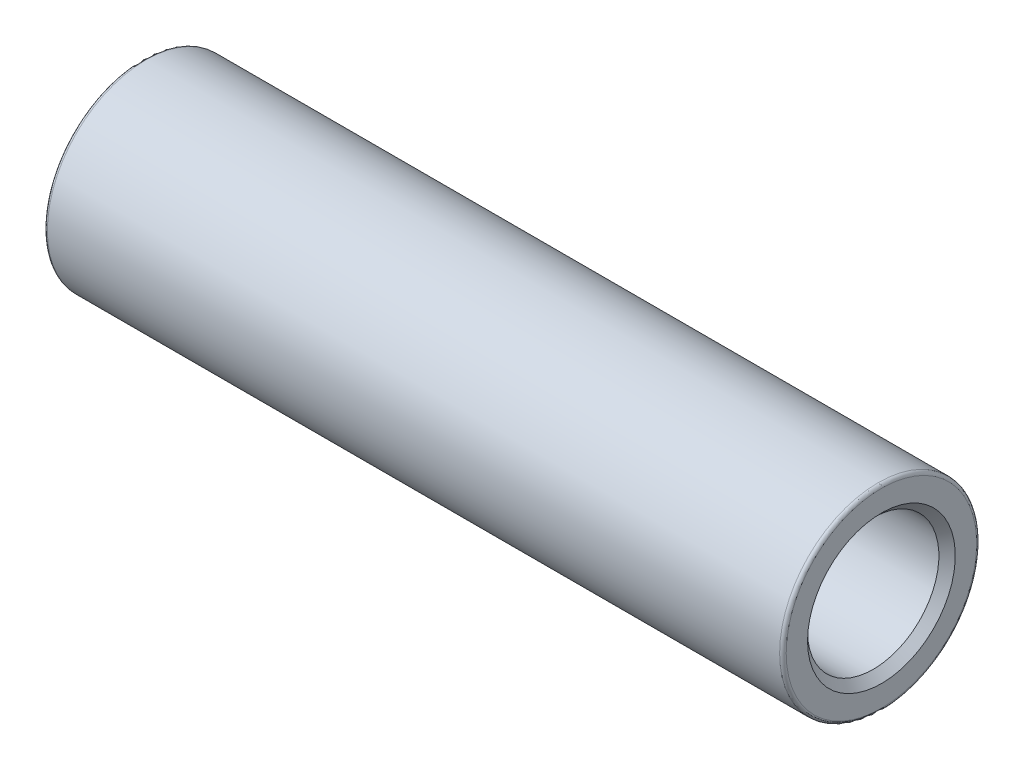
ISO-10303-21;
HEADER;
FILE_DESCRIPTION(('STEP AP214'),'2;1');
FILE_NAME('part.step','',(''),(''),'','','');
FILE_SCHEMA(('AUTOMOTIVE_DESIGN { 1 0 10303 214 1 1 1 1 }'));
ENDSEC;
DATA;
#1=APPLICATION_CONTEXT('core data for automotive mechanical design processes');
#2=APPLICATION_PROTOCOL_DEFINITION('international standard','automotive_design',2000,#1);
#3=PRODUCT_CONTEXT('',#1,'mechanical');
#4=PRODUCT('Part','Part','',(#3));
#5=PRODUCT_RELATED_PRODUCT_CATEGORY('part','',(#4));
#6=PRODUCT_DEFINITION_FORMATION('','',#4);
#7=PRODUCT_DEFINITION_CONTEXT('part definition',#1,'design');
#8=PRODUCT_DEFINITION('design','',#6,#7);
#9=PRODUCT_DEFINITION_SHAPE('','',#8);
#10=(LENGTH_UNIT() NAMED_UNIT(*) SI_UNIT(.MILLI.,.METRE.));
#11=(NAMED_UNIT(*) PLANE_ANGLE_UNIT() SI_UNIT($,.RADIAN.));
#12=(NAMED_UNIT(*) SI_UNIT($,.STERADIAN.) SOLID_ANGLE_UNIT());
#13=UNCERTAINTY_MEASURE_WITH_UNIT(LENGTH_MEASURE(1.E-05),#10,'distance_accuracy_value','');
#14=(GEOMETRIC_REPRESENTATION_CONTEXT(3) GLOBAL_UNCERTAINTY_ASSIGNED_CONTEXT((#13)) GLOBAL_UNIT_ASSIGNED_CONTEXT((#10,
#11,#12)) REPRESENTATION_CONTEXT('',''));
#15=CARTESIAN_POINT('',(0.,0.,0.));
#16=DIRECTION('',(0.,0.,1.));
#17=DIRECTION('',(1.,0.,0.));
#18=AXIS2_PLACEMENT_3D('',#15,#16,#17);
#19=CARTESIAN_POINT('',(-32.2635156377837,0.,0.));
#20=DIRECTION('',(-1.,0.,0.));
#21=DIRECTION('',(0.,0.,1.));
#22=AXIS2_PLACEMENT_3D('',#19,#20,#21);
#23=CYLINDRICAL_SURFACE('',#22,6.);
#24=CARTESIAN_POINT('',(-22.3,0.,0.));
#25=DIRECTION('',(1.,0.,0.));
#26=DIRECTION('',(0.,0.,-1.));
#27=AXIS2_PLACEMENT_3D('',#24,#25,#26);
#28=CIRCLE('',#27,6.);
#29=CARTESIAN_POINT('',(-22.3,0.,-6.));
#30=VERTEX_POINT('',#29);
#31=EDGE_CURVE('E38',#30,#30,#28,.T.);
#32=ORIENTED_EDGE('',*,*,#31,.T.);
#33=EDGE_LOOP('',(#32));
#34=FACE_BOUND('',#33,.T.);
#35=CARTESIAN_POINT('',(22.3,0.,0.));
#36=DIRECTION('',(-1.,0.,0.));
#37=DIRECTION('',(0.,0.,1.));
#38=AXIS2_PLACEMENT_3D('',#35,#36,#37);
#39=CIRCLE('',#38,6.);
#40=CARTESIAN_POINT('',(22.3,0.,6.));
#41=VERTEX_POINT('',#40);
#42=EDGE_CURVE('E41',#41,#41,#39,.T.);
#43=ORIENTED_EDGE('',*,*,#42,.T.);
#44=EDGE_LOOP('',(#43));
#45=FACE_BOUND('',#44,.T.);
#46=ADVANCED_FACE('F15',(#34,#45),#23,.T.);
#47=CARTESIAN_POINT('',(22.5,6.,0.));
#48=DIRECTION('',(-1.,0.,0.));
#49=DIRECTION('',(0.,0.,1.));
#50=AXIS2_PLACEMENT_3D('',#47,#48,#49);
#51=PLANE('',#50);
#52=CARTESIAN_POINT('',(22.5,0.,0.));
#53=DIRECTION('',(-1.,0.,0.));
#54=DIRECTION('',(0.,0.,1.));
#55=AXIS2_PLACEMENT_3D('',#52,#53,#54);
#56=CIRCLE('',#55,4.5);
#57=CARTESIAN_POINT('',(22.5,0.,4.5));
#58=VERTEX_POINT('',#57);
#59=EDGE_CURVE('E10',#58,#58,#56,.T.);
#60=ORIENTED_EDGE('',*,*,#59,.T.);
#61=EDGE_LOOP('',(#60));
#62=FACE_BOUND('',#61,.T.);
#63=CARTESIAN_POINT('',(22.5,0.,0.));
#64=DIRECTION('',(-1.,0.,0.));
#65=DIRECTION('',(0.,0.,1.));
#66=AXIS2_PLACEMENT_3D('',#63,#64,#65);
#67=CIRCLE('',#66,5.8);
#68=CARTESIAN_POINT('',(22.5,0.,5.8));
#69=VERTEX_POINT('',#68);
#70=EDGE_CURVE('E35',#69,#69,#67,.F.);
#71=ORIENTED_EDGE('',*,*,#70,.T.);
#72=EDGE_LOOP('',(#71));
#73=FACE_BOUND('',#72,.T.);
#74=ADVANCED_FACE('F69',(#62,#73),#51,.F.);
#75=CARTESIAN_POINT('',(-32.2635156377837,0.,0.));
#76=DIRECTION('',(-1.,0.,0.));
#77=DIRECTION('',(0.,0.,1.));
#78=AXIS2_PLACEMENT_3D('',#75,#76,#77);
#79=CYLINDRICAL_SURFACE('',#78,4.);
#80=CARTESIAN_POINT('',(-22.,0.,0.));
#81=DIRECTION('',(1.,0.,0.));
#82=DIRECTION('',(0.,0.,-1.));
#83=AXIS2_PLACEMENT_3D('',#80,#81,#82);
#84=CIRCLE('',#83,4.);
#85=CARTESIAN_POINT('',(-22.,0.,-4.));
#86=VERTEX_POINT('',#85);
#87=EDGE_CURVE('E26',#86,#86,#84,.F.);
#88=ORIENTED_EDGE('',*,*,#87,.T.);
#89=EDGE_LOOP('',(#88));
#90=FACE_BOUND('',#89,.T.);
#91=CARTESIAN_POINT('',(22.,0.,0.));
#92=DIRECTION('',(-1.,0.,0.));
#93=DIRECTION('',(0.,0.,1.));
#94=AXIS2_PLACEMENT_3D('',#91,#92,#93);
#95=CIRCLE('',#94,4.);
#96=CARTESIAN_POINT('',(22.,0.,4.));
#97=VERTEX_POINT('',#96);
#98=EDGE_CURVE('E30',#97,#97,#95,.F.);
#99=ORIENTED_EDGE('',*,*,#98,.T.);
#100=EDGE_LOOP('',(#99));
#101=FACE_BOUND('',#100,.T.);
#102=ADVANCED_FACE('F64',(#90,#101),#79,.F.);
#103=CARTESIAN_POINT('',(-22.5,6.,0.));
#104=DIRECTION('',(1.,0.,0.));
#105=DIRECTION('',(0.,0.,-1.));
#106=AXIS2_PLACEMENT_3D('',#103,#104,#105);
#107=PLANE('',#106);
#108=CARTESIAN_POINT('',(-22.5,0.,0.));
#109=DIRECTION('',(1.,0.,0.));
#110=DIRECTION('',(0.,0.,-1.));
#111=AXIS2_PLACEMENT_3D('',#108,#109,#110);
#112=CIRCLE('',#111,4.5);
#113=CARTESIAN_POINT('',(-22.5,0.,-4.5));
#114=VERTEX_POINT('',#113);
#115=EDGE_CURVE('E22',#114,#114,#112,.T.);
#116=ORIENTED_EDGE('',*,*,#115,.T.);
#117=EDGE_LOOP('',(#116));
#118=FACE_BOUND('',#117,.T.);
#119=CARTESIAN_POINT('',(-22.5,0.,0.));
#120=DIRECTION('',(1.,0.,0.));
#121=DIRECTION('',(0.,0.,-1.));
#122=AXIS2_PLACEMENT_3D('',#119,#120,#121);
#123=CIRCLE('',#122,5.8);
#124=CARTESIAN_POINT('',(-22.5,0.,-5.8));
#125=VERTEX_POINT('',#124);
#126=EDGE_CURVE('E44',#125,#125,#123,.F.);
#127=ORIENTED_EDGE('',*,*,#126,.T.);
#128=EDGE_LOOP('',(#127));
#129=FACE_BOUND('',#128,.T.);
#130=ADVANCED_FACE('F48',(#118,#129),#107,.F.);
#131=CARTESIAN_POINT('',(-22.3,0.,0.));
#132=DIRECTION('',(1.,0.,0.));
#133=DIRECTION('',(0.,0.,-1.));
#134=AXIS2_PLACEMENT_3D('',#131,#132,#133);
#135=TOROIDAL_SURFACE('',#134,5.8,0.2);
#136=ORIENTED_EDGE('',*,*,#31,.F.);
#137=EDGE_LOOP('',(#136));
#138=FACE_BOUND('',#137,.T.);
#139=ORIENTED_EDGE('',*,*,#126,.F.);
#140=EDGE_LOOP('',(#139));
#141=FACE_BOUND('',#140,.T.);
#142=ADVANCED_FACE('F50',(#138,#141),#135,.T.);
#143=CARTESIAN_POINT('',(22.3,0.,0.));
#144=DIRECTION('',(-1.,0.,0.));
#145=DIRECTION('',(0.,0.,1.));
#146=AXIS2_PLACEMENT_3D('',#143,#144,#145);
#147=TOROIDAL_SURFACE('',#146,5.8,0.2);
#148=ORIENTED_EDGE('',*,*,#70,.F.);
#149=EDGE_LOOP('',(#148));
#150=FACE_BOUND('',#149,.T.);
#151=ORIENTED_EDGE('',*,*,#42,.F.);
#152=EDGE_LOOP('',(#151));
#153=FACE_BOUND('',#152,.T.);
#154=ADVANCED_FACE('F52',(#150,#153),#147,.T.);
#155=CARTESIAN_POINT('',(-22.,0.,0.));
#156=DIRECTION('',(-1.,0.,0.));
#157=DIRECTION('',(0.,0.,1.));
#158=AXIS2_PLACEMENT_3D('',#155,#156,#157);
#159=CONICAL_SURFACE('',#158,4.,0.785398163397448);
#160=ORIENTED_EDGE('',*,*,#115,.F.);
#161=EDGE_LOOP('',(#160));
#162=FACE_BOUND('',#161,.T.);
#163=ORIENTED_EDGE('',*,*,#87,.F.);
#164=EDGE_LOOP('',(#163));
#165=FACE_BOUND('',#164,.T.);
#166=ADVANCED_FACE('F61',(#162,#165),#159,.F.);
#167=CARTESIAN_POINT('',(22.5,0.,0.));
#168=DIRECTION('',(1.,0.,0.));
#169=DIRECTION('',(0.,0.,-1.));
#170=AXIS2_PLACEMENT_3D('',#167,#168,#169);
#171=CONICAL_SURFACE('',#170,4.5,0.785398163397445);
#172=ORIENTED_EDGE('',*,*,#98,.F.);
#173=EDGE_LOOP('',(#172));
#174=FACE_BOUND('',#173,.T.);
#175=ORIENTED_EDGE('',*,*,#59,.F.);
#176=EDGE_LOOP('',(#175));
#177=FACE_BOUND('',#176,.T.);
#178=ADVANCED_FACE('F17',(#174,#177),#171,.F.);
#179=CLOSED_SHELL('',(#46,#74,#102,#130,#142,#154,#166,#178));
#180=MANIFOLD_SOLID_BREP('B1',#179);
#181=ADVANCED_BREP_SHAPE_REPRESENTATION('',(#18,#180),#14);
#182=SHAPE_DEFINITION_REPRESENTATION(#9,#181);
ENDSEC;
END-ISO-10303-21;
